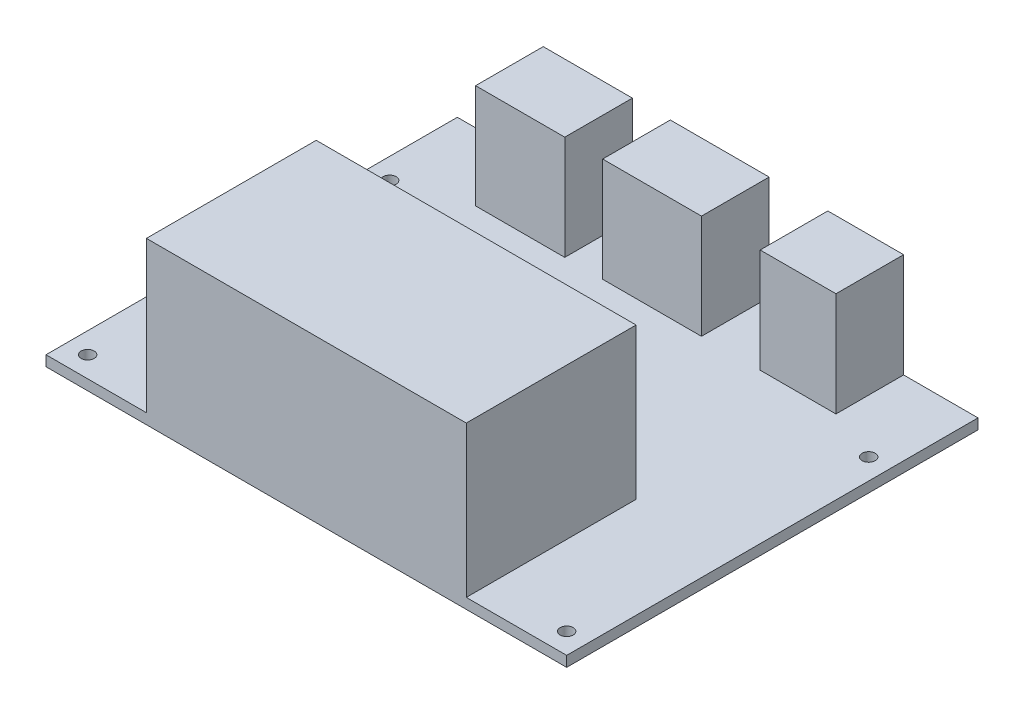
ISO-10303-21;
HEADER;
FILE_DESCRIPTION(('STEP AP214'),'2;1');
FILE_NAME('part.step','',(''),(''),'','','');
FILE_SCHEMA(('AUTOMOTIVE_DESIGN { 1 0 10303 214 1 1 1 1 }'));
ENDSEC;
DATA;
#1=APPLICATION_CONTEXT('core data for automotive mechanical design processes');
#2=APPLICATION_PROTOCOL_DEFINITION('international standard','automotive_design',2000,#1);
#3=PRODUCT_CONTEXT('',#1,'mechanical');
#4=PRODUCT('Part','Part','',(#3));
#5=PRODUCT_RELATED_PRODUCT_CATEGORY('part','',(#4));
#6=PRODUCT_DEFINITION_FORMATION('','',#4);
#7=PRODUCT_DEFINITION_CONTEXT('part definition',#1,'design');
#8=PRODUCT_DEFINITION('design','',#6,#7);
#9=PRODUCT_DEFINITION_SHAPE('','',#8);
#10=(LENGTH_UNIT() NAMED_UNIT(*) SI_UNIT(.MILLI.,.METRE.));
#11=(NAMED_UNIT(*) PLANE_ANGLE_UNIT() SI_UNIT($,.RADIAN.));
#12=(NAMED_UNIT(*) SI_UNIT($,.STERADIAN.) SOLID_ANGLE_UNIT());
#13=UNCERTAINTY_MEASURE_WITH_UNIT(LENGTH_MEASURE(1.E-05),#10,'distance_accuracy_value','');
#14=(GEOMETRIC_REPRESENTATION_CONTEXT(3) GLOBAL_UNCERTAINTY_ASSIGNED_CONTEXT((#13)) GLOBAL_UNIT_ASSIGNED_CONTEXT((#10,
#11,#12)) REPRESENTATION_CONTEXT('',''));
#15=CARTESIAN_POINT('',(0.,0.,0.));
#16=DIRECTION('',(0.,0.,1.));
#17=DIRECTION('',(1.,0.,0.));
#18=AXIS2_PLACEMENT_3D('',#15,#16,#17);
#19=CARTESIAN_POINT('',(0.,2.,0.));
#20=DIRECTION('',(0.,-1.,0.));
#21=DIRECTION('',(0.,0.,-1.));
#22=AXIS2_PLACEMENT_3D('',#19,#20,#21);
#23=PLANE('',#22);
#24=CARTESIAN_POINT('',(-46.,2.,-22.5));
#25=DIRECTION('',(0.,1.,0.));
#26=DIRECTION('',(0.,0.,1.));
#27=AXIS2_PLACEMENT_3D('',#24,#25,#26);
#28=CIRCLE('',#27,1.25);
#29=CARTESIAN_POINT('',(-46.,2.,-21.25));
#30=VERTEX_POINT('',#29);
#31=EDGE_CURVE('E437',#30,#30,#28,.T.);
#32=ORIENTED_EDGE('',*,*,#31,.F.);
#33=EDGE_LOOP('',(#32));
#34=FACE_BOUND('',#33,.T.);
#35=CARTESIAN_POINT('',(46.,2.,-22.5));
#36=DIRECTION('',(0.,1.,0.));
#37=DIRECTION('',(0.,0.,1.));
#38=AXIS2_PLACEMENT_3D('',#35,#36,#37);
#39=CIRCLE('',#38,1.25);
#40=CARTESIAN_POINT('',(46.,2.,-21.25));
#41=VERTEX_POINT('',#40);
#42=EDGE_CURVE('E429',#41,#41,#39,.T.);
#43=ORIENTED_EDGE('',*,*,#42,.F.);
#44=EDGE_LOOP('',(#43));
#45=FACE_BOUND('',#44,.T.);
#46=CARTESIAN_POINT('',(46.,2.,35.5));
#47=DIRECTION('',(0.,1.,0.));
#48=DIRECTION('',(0.,0.,1.));
#49=AXIS2_PLACEMENT_3D('',#46,#47,#48);
#50=CIRCLE('',#49,1.25);
#51=CARTESIAN_POINT('',(46.,2.,36.75));
#52=VERTEX_POINT('',#51);
#53=EDGE_CURVE('E421',#52,#52,#50,.T.);
#54=ORIENTED_EDGE('',*,*,#53,.F.);
#55=EDGE_LOOP('',(#54));
#56=FACE_BOUND('',#55,.T.);
#57=CARTESIAN_POINT('',(-46.,2.,35.5));
#58=DIRECTION('',(0.,1.,0.));
#59=DIRECTION('',(0.,0.,1.));
#60=AXIS2_PLACEMENT_3D('',#57,#58,#59);
#61=CIRCLE('',#60,1.25);
#62=CARTESIAN_POINT('',(-46.,2.,36.75));
#63=VERTEX_POINT('',#62);
#64=EDGE_CURVE('E413',#63,#63,#61,.T.);
#65=ORIENTED_EDGE('',*,*,#64,.F.);
#66=EDGE_LOOP('',(#65));
#67=FACE_BOUND('',#66,.T.);
#68=DIRECTION('',(0.,0.,1.));
#69=VECTOR('',#68,1.);
#70=CARTESIAN_POINT('',(21.1569560609766,2.,-39.5));
#71=LINE('',#70,#69);
#72=CARTESIAN_POINT('',(21.1569560609766,2.,-39.5));
#73=VERTEX_POINT('',#72);
#74=CARTESIAN_POINT('',(21.1569560609766,2.,-26.5086312871932));
#75=VERTEX_POINT('',#74);
#76=EDGE_CURVE('E219',#73,#75,#71,.T.);
#77=ORIENTED_EDGE('',*,*,#76,.F.);
#78=DIRECTION('',(-1.,0.,0.));
#79=VECTOR('',#78,1.);
#80=CARTESIAN_POINT('',(-50.,2.,-39.5));
#81=LINE('',#80,#79);
#82=CARTESIAN_POINT('',(9.88276025108013,2.,-39.5));
#83=VERTEX_POINT('',#82);
#84=EDGE_CURVE('E204',#73,#83,#81,.T.);
#85=ORIENTED_EDGE('',*,*,#84,.T.);
#86=DIRECTION('',(0.,0.,-1.));
#87=VECTOR('',#86,1.);
#88=CARTESIAN_POINT('',(9.88276025108013,2.,-39.5));
#89=LINE('',#88,#87);
#90=CARTESIAN_POINT('',(9.88276025108013,2.,-26.5086312871932));
#91=VERTEX_POINT('',#90);
#92=EDGE_CURVE('E266',#91,#83,#89,.T.);
#93=ORIENTED_EDGE('',*,*,#92,.F.);
#94=DIRECTION('',(1.,0.,0.));
#95=VECTOR('',#94,1.);
#96=CARTESIAN_POINT('',(-9.09784788456836,2.,-26.5086312871932));
#97=LINE('',#96,#95);
#98=CARTESIAN_POINT('',(-9.09784788456836,2.,-26.5086312871932));
#99=VERTEX_POINT('',#98);
#100=EDGE_CURVE('E269',#99,#91,#97,.T.);
#101=ORIENTED_EDGE('',*,*,#100,.F.);
#102=DIRECTION('',(0.,0.,1.));
#103=VECTOR('',#102,1.);
#104=CARTESIAN_POINT('',(-9.09784788456836,2.,-39.5));
#105=LINE('',#104,#103);
#106=CARTESIAN_POINT('',(-9.09784788456836,2.,-39.5));
#107=VERTEX_POINT('',#106);
#108=EDGE_CURVE('E274',#107,#99,#105,.T.);
#109=ORIENTED_EDGE('',*,*,#108,.F.);
#110=CARTESIAN_POINT('',(-16.376126192223,2.,-39.5));
#111=VERTEX_POINT('',#110);
#112=EDGE_CURVE('E216',#107,#111,#81,.T.);
#113=ORIENTED_EDGE('',*,*,#112,.T.);
#114=DIRECTION('',(0.,0.,-1.));
#115=VECTOR('',#114,1.);
#116=CARTESIAN_POINT('',(-16.376126192223,2.,-39.5));
#117=LINE('',#116,#115);
#118=CARTESIAN_POINT('',(-16.376126192223,2.,-26.5086312871932));
#119=VERTEX_POINT('',#118);
#120=EDGE_CURVE('E295',#119,#111,#117,.T.);
#121=ORIENTED_EDGE('',*,*,#120,.F.);
#122=DIRECTION('',(1.,0.,0.));
#123=VECTOR('',#122,1.);
#124=CARTESIAN_POINT('',(-33.5014869161164,2.,-26.5086312871932));
#125=LINE('',#124,#123);
#126=CARTESIAN_POINT('',(-33.5014869161164,2.,-26.5086312871932));
#127=VERTEX_POINT('',#126);
#128=EDGE_CURVE('E308',#127,#119,#125,.T.);
#129=ORIENTED_EDGE('',*,*,#128,.F.);
#130=DIRECTION('',(0.,0.,1.));
#131=VECTOR('',#130,1.);
#132=CARTESIAN_POINT('',(-33.5014869161164,2.,-39.5));
#133=LINE('',#132,#131);
#134=CARTESIAN_POINT('',(-33.5014869161164,2.,-39.5));
#135=VERTEX_POINT('',#134);
#136=EDGE_CURVE('E278',#135,#127,#133,.T.);
#137=ORIENTED_EDGE('',*,*,#136,.F.);
#138=CARTESIAN_POINT('',(-50.,2.,-39.5));
#139=VERTEX_POINT('',#138);
#140=EDGE_CURVE('E448',#135,#139,#81,.T.);
#141=ORIENTED_EDGE('',*,*,#140,.T.);
#142=DIRECTION('',(0.,0.,1.));
#143=VECTOR('',#142,1.);
#144=CARTESIAN_POINT('',(-50.,2.,39.5));
#145=LINE('',#144,#143);
#146=CARTESIAN_POINT('',(-50.,2.,39.5));
#147=VERTEX_POINT('',#146);
#148=EDGE_CURVE('E452',#139,#147,#145,.T.);
#149=ORIENTED_EDGE('',*,*,#148,.T.);
#150=DIRECTION('',(1.,0.,0.));
#151=VECTOR('',#150,1.);
#152=CARTESIAN_POINT('',(-50.,2.,39.5));
#153=LINE('',#152,#151);
#154=CARTESIAN_POINT('',(-30.7186157984837,2.,39.5));
#155=VERTEX_POINT('',#154);
#156=EDGE_CURVE('E456',#147,#155,#153,.T.);
#157=ORIENTED_EDGE('',*,*,#156,.T.);
#158=DIRECTION('',(0.,0.,1.));
#159=VECTOR('',#158,1.);
#160=CARTESIAN_POINT('',(-30.7186157984837,2.,39.5));
#161=LINE('',#160,#159);
#162=CARTESIAN_POINT('',(-30.7186157984837,2.,6.88582212439877));
#163=VERTEX_POINT('',#162);
#164=EDGE_CURVE('E330',#163,#155,#161,.T.);
#165=ORIENTED_EDGE('',*,*,#164,.F.);
#166=DIRECTION('',(-1.,0.,0.));
#167=VECTOR('',#166,1.);
#168=CARTESIAN_POINT('',(-30.7186157984837,2.,6.88582212439877));
#169=LINE('',#168,#167);
#170=CARTESIAN_POINT('',(30.7186157984837,2.,6.88582212439877));
#171=VERTEX_POINT('',#170);
#172=EDGE_CURVE('E336',#171,#163,#169,.T.);
#173=ORIENTED_EDGE('',*,*,#172,.F.);
#174=DIRECTION('',(0.,0.,-1.));
#175=VECTOR('',#174,1.);
#176=CARTESIAN_POINT('',(30.7186157984837,2.,39.5));
#177=LINE('',#176,#175);
#178=CARTESIAN_POINT('',(30.7186157984837,2.,39.5));
#179=VERTEX_POINT('',#178);
#180=EDGE_CURVE('E349',#179,#171,#177,.T.);
#181=ORIENTED_EDGE('',*,*,#180,.F.);
#182=CARTESIAN_POINT('',(50.,2.,39.5));
#183=VERTEX_POINT('',#182);
#184=EDGE_CURVE('E455',#179,#183,#153,.T.);
#185=ORIENTED_EDGE('',*,*,#184,.T.);
#186=DIRECTION('',(0.,0.,-1.));
#187=VECTOR('',#186,1.);
#188=CARTESIAN_POINT('',(50.,2.,39.5));
#189=LINE('',#188,#187);
#190=CARTESIAN_POINT('',(50.,2.,-39.5));
#191=VERTEX_POINT('',#190);
#192=EDGE_CURVE('E445',#183,#191,#189,.T.);
#193=ORIENTED_EDGE('',*,*,#192,.T.);
#194=CARTESIAN_POINT('',(35.713512676286,2.,-39.5));
#195=VERTEX_POINT('',#194);
#196=EDGE_CURVE('E215',#191,#195,#81,.T.);
#197=ORIENTED_EDGE('',*,*,#196,.T.);
#198=DIRECTION('',(0.,0.,-1.));
#199=VECTOR('',#198,1.);
#200=CARTESIAN_POINT('',(35.713512676286,2.,-39.5));
#201=LINE('',#200,#199);
#202=CARTESIAN_POINT('',(35.713512676286,2.,-26.5086312871932));
#203=VERTEX_POINT('',#202);
#204=EDGE_CURVE('E64',#203,#195,#201,.T.);
#205=ORIENTED_EDGE('',*,*,#204,.F.);
#206=DIRECTION('',(1.,0.,0.));
#207=VECTOR('',#206,1.);
#208=CARTESIAN_POINT('',(21.1569560609766,2.,-26.5086312871932));
#209=LINE('',#208,#207);
#210=EDGE_CURVE('E59',#75,#203,#209,.T.);
#211=ORIENTED_EDGE('',*,*,#210,.F.);
#212=EDGE_LOOP('',(#77,#85,#93,#101,#109,#113,#121,#129,#137,#141,#149,#157,#165,#173,#181,#185,
#193,#197,#205,#211));
#213=FACE_BOUND('',#212,.T.);
#214=ADVANCED_FACE('F43',(#34,#45,#56,#67,#213),#23,.F.);
#215=CARTESIAN_POINT('',(0.,0.,0.));
#216=DIRECTION('',(0.,-1.,0.));
#217=DIRECTION('',(0.,0.,-1.));
#218=AXIS2_PLACEMENT_3D('',#215,#216,#217);
#219=PLANE('',#218);
#220=CARTESIAN_POINT('',(46.,0.,35.5));
#221=DIRECTION('',(0.,1.,0.));
#222=DIRECTION('',(0.,0.,1.));
#223=AXIS2_PLACEMENT_3D('',#220,#221,#222);
#224=CIRCLE('',#223,1.25);
#225=CARTESIAN_POINT('',(46.,0.,36.75));
#226=VERTEX_POINT('',#225);
#227=EDGE_CURVE('E417',#226,#226,#224,.T.);
#228=ORIENTED_EDGE('',*,*,#227,.T.);
#229=EDGE_LOOP('',(#228));
#230=FACE_BOUND('',#229,.T.);
#231=CARTESIAN_POINT('',(-46.,0.,-22.5));
#232=DIRECTION('',(0.,1.,0.));
#233=DIRECTION('',(0.,0.,1.));
#234=AXIS2_PLACEMENT_3D('',#231,#232,#233);
#235=CIRCLE('',#234,1.25);
#236=CARTESIAN_POINT('',(-46.,0.,-21.25));
#237=VERTEX_POINT('',#236);
#238=EDGE_CURVE('E433',#237,#237,#235,.T.);
#239=ORIENTED_EDGE('',*,*,#238,.T.);
#240=EDGE_LOOP('',(#239));
#241=FACE_BOUND('',#240,.T.);
#242=DIRECTION('',(0.,0.,-1.));
#243=VECTOR('',#242,1.);
#244=CARTESIAN_POINT('',(50.,0.,39.5));
#245=LINE('',#244,#243);
#246=CARTESIAN_POINT('',(50.,0.,39.5));
#247=VERTEX_POINT('',#246);
#248=CARTESIAN_POINT('',(50.,0.,-39.5));
#249=VERTEX_POINT('',#248);
#250=EDGE_CURVE('E441',#247,#249,#245,.T.);
#251=ORIENTED_EDGE('',*,*,#250,.F.);
#252=DIRECTION('',(1.,0.,0.));
#253=VECTOR('',#252,1.);
#254=CARTESIAN_POINT('',(-50.,0.,39.5));
#255=LINE('',#254,#253);
#256=CARTESIAN_POINT('',(-50.,0.,39.5));
#257=VERTEX_POINT('',#256);
#258=EDGE_CURVE('E449',#257,#247,#255,.T.);
#259=ORIENTED_EDGE('',*,*,#258,.F.);
#260=DIRECTION('',(0.,0.,1.));
#261=VECTOR('',#260,1.);
#262=CARTESIAN_POINT('',(-50.,0.,39.5));
#263=LINE('',#262,#261);
#264=CARTESIAN_POINT('',(-50.,0.,-39.5));
#265=VERTEX_POINT('',#264);
#266=EDGE_CURVE('E466',#265,#257,#263,.T.);
#267=ORIENTED_EDGE('',*,*,#266,.F.);
#268=DIRECTION('',(-1.,0.,0.));
#269=VECTOR('',#268,1.);
#270=CARTESIAN_POINT('',(-50.,0.,-39.5));
#271=LINE('',#270,#269);
#272=EDGE_CURVE('E463',#249,#265,#271,.T.);
#273=ORIENTED_EDGE('',*,*,#272,.F.);
#274=EDGE_LOOP('',(#251,#259,#267,#273));
#275=FACE_BOUND('',#274,.T.);
#276=CARTESIAN_POINT('',(46.,0.,-22.5));
#277=DIRECTION('',(0.,1.,0.));
#278=DIRECTION('',(0.,0.,1.));
#279=AXIS2_PLACEMENT_3D('',#276,#277,#278);
#280=CIRCLE('',#279,1.25);
#281=CARTESIAN_POINT('',(46.,0.,-21.25));
#282=VERTEX_POINT('',#281);
#283=EDGE_CURVE('E425',#282,#282,#280,.T.);
#284=ORIENTED_EDGE('',*,*,#283,.T.);
#285=EDGE_LOOP('',(#284));
#286=FACE_BOUND('',#285,.T.);
#287=CARTESIAN_POINT('',(-46.,0.,35.5));
#288=DIRECTION('',(0.,1.,0.));
#289=DIRECTION('',(0.,0.,1.));
#290=AXIS2_PLACEMENT_3D('',#287,#288,#289);
#291=CIRCLE('',#290,1.25);
#292=CARTESIAN_POINT('',(-46.,0.,36.75));
#293=VERTEX_POINT('',#292);
#294=EDGE_CURVE('E412',#293,#293,#291,.T.);
#295=ORIENTED_EDGE('',*,*,#294,.T.);
#296=EDGE_LOOP('',(#295));
#297=FACE_BOUND('',#296,.T.);
#298=DIRECTION('',(1.,0.,0.));
#299=VECTOR('',#298,1.);
#300=CARTESIAN_POINT('',(-27.1122110581234,0.,8.12896276269668));
#301=LINE('',#300,#299);
#302=CARTESIAN_POINT('',(-27.1122110581234,0.,8.12896276269668));
#303=VERTEX_POINT('',#302);
#304=CARTESIAN_POINT('',(-4.48818242846663,0.,8.12896276269668));
#305=VERTEX_POINT('',#304);
#306=EDGE_CURVE('E390',#303,#305,#301,.T.);
#307=ORIENTED_EDGE('',*,*,#306,.F.);
#308=DIRECTION('',(0.,0.,-1.));
#309=VECTOR('',#308,1.);
#310=CARTESIAN_POINT('',(-27.1122110581234,0.,22.106111340181));
#311=LINE('',#310,#309);
#312=CARTESIAN_POINT('',(-27.1122110581234,0.,22.106111340181));
#313=VERTEX_POINT('',#312);
#314=EDGE_CURVE('E371',#313,#303,#311,.T.);
#315=ORIENTED_EDGE('',*,*,#314,.F.);
#316=DIRECTION('',(-1.,0.,0.));
#317=VECTOR('',#316,1.);
#318=CARTESIAN_POINT('',(-27.1122110581234,0.,22.106111340181));
#319=LINE('',#318,#317);
#320=CARTESIAN_POINT('',(-4.48818242846663,0.,22.106111340181));
#321=VERTEX_POINT('',#320);
#322=EDGE_CURVE('E377',#321,#313,#319,.T.);
#323=ORIENTED_EDGE('',*,*,#322,.F.);
#324=DIRECTION('',(0.,0.,1.));
#325=VECTOR('',#324,1.);
#326=CARTESIAN_POINT('',(-4.48818242846663,0.,22.106111340181));
#327=LINE('',#326,#325);
#328=EDGE_CURVE('E393',#305,#321,#327,.T.);
#329=ORIENTED_EDGE('',*,*,#328,.F.);
#330=EDGE_LOOP('',(#307,#315,#323,#329));
#331=FACE_BOUND('',#330,.T.);
#332=ADVANCED_FACE('F488',(#230,#241,#275,#286,#297,#331),#219,.T.);
#333=CARTESIAN_POINT('',(50.,2.,39.5));
#334=DIRECTION('',(-1.,0.,0.));
#335=DIRECTION('',(0.,0.,1.));
#336=AXIS2_PLACEMENT_3D('',#333,#334,#335);
#337=PLANE('',#336);
#338=ORIENTED_EDGE('',*,*,#250,.T.);
#339=DIRECTION('',(0.,-1.,0.));
#340=VECTOR('',#339,1.);
#341=CARTESIAN_POINT('',(50.,2.,-39.5));
#342=LINE('',#341,#340);
#343=EDGE_CURVE('E11',#191,#249,#342,.T.);
#344=ORIENTED_EDGE('',*,*,#343,.F.);
#345=ORIENTED_EDGE('',*,*,#192,.F.);
#346=DIRECTION('',(0.,-1.,0.));
#347=VECTOR('',#346,1.);
#348=CARTESIAN_POINT('',(50.,2.,39.5));
#349=LINE('',#348,#347);
#350=EDGE_CURVE('E459',#183,#247,#349,.T.);
#351=ORIENTED_EDGE('',*,*,#350,.T.);
#352=EDGE_LOOP('',(#338,#344,#345,#351));
#353=FACE_BOUND('',#352,.T.);
#354=ADVANCED_FACE('F45',(#353),#337,.F.);
#355=CARTESIAN_POINT('',(-50.,2.,-39.5));
#356=DIRECTION('',(0.,0.,1.));
#357=DIRECTION('',(1.,0.,0.));
#358=AXIS2_PLACEMENT_3D('',#355,#356,#357);
#359=PLANE('',#358);
#360=ORIENTED_EDGE('',*,*,#272,.T.);
#361=DIRECTION('',(0.,-1.,0.));
#362=VECTOR('',#361,1.);
#363=CARTESIAN_POINT('',(-50.,2.,-39.5));
#364=LINE('',#363,#362);
#365=EDGE_CURVE('E52',#139,#265,#364,.T.);
#366=ORIENTED_EDGE('',*,*,#365,.F.);
#367=ORIENTED_EDGE('',*,*,#140,.F.);
#368=DIRECTION('',(0.,-1.,0.));
#369=VECTOR('',#368,1.);
#370=CARTESIAN_POINT('',(-33.5014869161164,22.,-39.5));
#371=LINE('',#370,#369);
#372=CARTESIAN_POINT('',(-33.5014869161164,22.,-39.5));
#373=VERTEX_POINT('',#372);
#374=EDGE_CURVE('E304',#373,#135,#371,.T.);
#375=ORIENTED_EDGE('',*,*,#374,.F.);
#376=DIRECTION('',(-1.,0.,0.));
#377=VECTOR('',#376,1.);
#378=CARTESIAN_POINT('',(-33.5014869161164,22.,-39.5));
#379=LINE('',#378,#377);
#380=CARTESIAN_POINT('',(-16.376126192223,22.,-39.5));
#381=VERTEX_POINT('',#380);
#382=EDGE_CURVE('E301',#381,#373,#379,.T.);
#383=ORIENTED_EDGE('',*,*,#382,.F.);
#384=DIRECTION('',(0.,-1.,0.));
#385=VECTOR('',#384,1.);
#386=CARTESIAN_POINT('',(-16.376126192223,22.,-39.5));
#387=LINE('',#386,#385);
#388=EDGE_CURVE('E318',#381,#111,#387,.T.);
#389=ORIENTED_EDGE('',*,*,#388,.T.);
#390=ORIENTED_EDGE('',*,*,#112,.F.);
#391=DIRECTION('',(0.,-1.,0.));
#392=VECTOR('',#391,1.);
#393=CARTESIAN_POINT('',(-9.09784788456836,22.,-39.5));
#394=LINE('',#393,#392);
#395=CARTESIAN_POINT('',(-9.09784788456836,22.,-39.5));
#396=VERTEX_POINT('',#395);
#397=EDGE_CURVE('E261',#396,#107,#394,.T.);
#398=ORIENTED_EDGE('',*,*,#397,.F.);
#399=DIRECTION('',(-1.,0.,0.));
#400=VECTOR('',#399,1.);
#401=CARTESIAN_POINT('',(-9.09784788456836,22.,-39.5));
#402=LINE('',#401,#400);
#403=CARTESIAN_POINT('',(9.88276025108013,22.,-39.5));
#404=VERTEX_POINT('',#403);
#405=EDGE_CURVE('E265',#404,#396,#402,.T.);
#406=ORIENTED_EDGE('',*,*,#405,.F.);
#407=DIRECTION('',(0.,-1.,0.));
#408=VECTOR('',#407,1.);
#409=CARTESIAN_POINT('',(9.88276025108013,22.,-39.5));
#410=LINE('',#409,#408);
#411=EDGE_CURVE('E212',#404,#83,#410,.T.);
#412=ORIENTED_EDGE('',*,*,#411,.T.);
#413=ORIENTED_EDGE('',*,*,#84,.F.);
#414=DIRECTION('',(0.,-1.,0.));
#415=VECTOR('',#414,1.);
#416=CARTESIAN_POINT('',(21.1569560609766,22.,-39.5));
#417=LINE('',#416,#415);
#418=CARTESIAN_POINT('',(21.1569560609766,22.,-39.5));
#419=VERTEX_POINT('',#418);
#420=EDGE_CURVE('E208',#419,#73,#417,.T.);
#421=ORIENTED_EDGE('',*,*,#420,.F.);
#422=DIRECTION('',(-1.,0.,0.));
#423=VECTOR('',#422,1.);
#424=CARTESIAN_POINT('',(21.1569560609766,22.,-39.5));
#425=LINE('',#424,#423);
#426=CARTESIAN_POINT('',(35.713512676286,22.,-39.5));
#427=VERTEX_POINT('',#426);
#428=EDGE_CURVE('E229',#427,#419,#425,.T.);
#429=ORIENTED_EDGE('',*,*,#428,.F.);
#430=DIRECTION('',(0.,-1.,0.));
#431=VECTOR('',#430,1.);
#432=CARTESIAN_POINT('',(35.713512676286,22.,-39.5));
#433=LINE('',#432,#431);
#434=EDGE_CURVE('E230',#427,#195,#433,.T.);
#435=ORIENTED_EDGE('',*,*,#434,.T.);
#436=ORIENTED_EDGE('',*,*,#196,.F.);
#437=ORIENTED_EDGE('',*,*,#343,.T.);
#438=EDGE_LOOP('',(#360,#366,#367,#375,#383,#389,#390,#398,#406,#412,#413,#421,#429,#435,#436,#437));
#439=FACE_BOUND('',#438,.T.);
#440=ADVANCED_FACE('F205',(#439),#359,.F.);
#441=CARTESIAN_POINT('',(-50.,2.,39.5));
#442=DIRECTION('',(1.,0.,0.));
#443=DIRECTION('',(0.,0.,-1.));
#444=AXIS2_PLACEMENT_3D('',#441,#442,#443);
#445=PLANE('',#444);
#446=ORIENTED_EDGE('',*,*,#266,.T.);
#447=DIRECTION('',(0.,-1.,0.));
#448=VECTOR('',#447,1.);
#449=CARTESIAN_POINT('',(-50.,2.,39.5));
#450=LINE('',#449,#448);
#451=EDGE_CURVE('E474',#147,#257,#450,.T.);
#452=ORIENTED_EDGE('',*,*,#451,.F.);
#453=ORIENTED_EDGE('',*,*,#148,.F.);
#454=ORIENTED_EDGE('',*,*,#365,.T.);
#455=EDGE_LOOP('',(#446,#452,#453,#454));
#456=FACE_BOUND('',#455,.T.);
#457=ADVANCED_FACE('F483',(#456),#445,.F.);
#458=CARTESIAN_POINT('',(-50.,2.,39.5));
#459=DIRECTION('',(0.,0.,-1.));
#460=DIRECTION('',(-1.,0.,0.));
#461=AXIS2_PLACEMENT_3D('',#458,#459,#460);
#462=PLANE('',#461);
#463=ORIENTED_EDGE('',*,*,#258,.T.);
#464=ORIENTED_EDGE('',*,*,#350,.F.);
#465=ORIENTED_EDGE('',*,*,#184,.F.);
#466=DIRECTION('',(0.,-1.,0.));
#467=VECTOR('',#466,1.);
#468=CARTESIAN_POINT('',(30.7186157984837,31.,39.5));
#469=LINE('',#468,#467);
#470=CARTESIAN_POINT('',(30.7186157984837,31.,39.5));
#471=VERTEX_POINT('',#470);
#472=EDGE_CURVE('E363',#471,#179,#469,.T.);
#473=ORIENTED_EDGE('',*,*,#472,.F.);
#474=DIRECTION('',(1.,0.,0.));
#475=VECTOR('',#474,1.);
#476=CARTESIAN_POINT('',(-30.7186157984837,31.,39.5));
#477=LINE('',#476,#475);
#478=CARTESIAN_POINT('',(-30.7186157984837,31.,39.5));
#479=VERTEX_POINT('',#478);
#480=EDGE_CURVE('E335',#479,#471,#477,.T.);
#481=ORIENTED_EDGE('',*,*,#480,.F.);
#482=DIRECTION('',(0.,-1.,0.));
#483=VECTOR('',#482,1.);
#484=CARTESIAN_POINT('',(-30.7186157984837,31.,39.5));
#485=LINE('',#484,#483);
#486=EDGE_CURVE('E367',#479,#155,#485,.T.);
#487=ORIENTED_EDGE('',*,*,#486,.T.);
#488=ORIENTED_EDGE('',*,*,#156,.F.);
#489=ORIENTED_EDGE('',*,*,#451,.T.);
#490=EDGE_LOOP('',(#463,#464,#465,#473,#481,#487,#488,#489));
#491=FACE_BOUND('',#490,.T.);
#492=ADVANCED_FACE('F492',(#491),#462,.F.);
#493=CARTESIAN_POINT('',(-46.,2.,-22.5));
#494=DIRECTION('',(0.,-1.,0.));
#495=DIRECTION('',(0.,0.,-1.));
#496=AXIS2_PLACEMENT_3D('',#493,#494,#495);
#497=CYLINDRICAL_SURFACE('',#496,1.25);
#498=ORIENTED_EDGE('',*,*,#31,.T.);
#499=EDGE_LOOP('',(#498));
#500=FACE_BOUND('',#499,.T.);
#501=ORIENTED_EDGE('',*,*,#238,.F.);
#502=EDGE_LOOP('',(#501));
#503=FACE_BOUND('',#502,.T.);
#504=ADVANCED_FACE('F551',(#500,#503),#497,.F.);
#505=CARTESIAN_POINT('',(46.,2.,-22.5));
#506=DIRECTION('',(0.,-1.,0.));
#507=DIRECTION('',(0.,0.,-1.));
#508=AXIS2_PLACEMENT_3D('',#505,#506,#507);
#509=CYLINDRICAL_SURFACE('',#508,1.25);
#510=ORIENTED_EDGE('',*,*,#42,.T.);
#511=EDGE_LOOP('',(#510));
#512=FACE_BOUND('',#511,.T.);
#513=ORIENTED_EDGE('',*,*,#283,.F.);
#514=EDGE_LOOP('',(#513));
#515=FACE_BOUND('',#514,.T.);
#516=ADVANCED_FACE('F573',(#512,#515),#509,.F.);
#517=CARTESIAN_POINT('',(46.,2.,35.5));
#518=DIRECTION('',(0.,-1.,0.));
#519=DIRECTION('',(0.,0.,-1.));
#520=AXIS2_PLACEMENT_3D('',#517,#518,#519);
#521=CYLINDRICAL_SURFACE('',#520,1.25);
#522=ORIENTED_EDGE('',*,*,#53,.T.);
#523=EDGE_LOOP('',(#522));
#524=FACE_BOUND('',#523,.T.);
#525=ORIENTED_EDGE('',*,*,#227,.F.);
#526=EDGE_LOOP('',(#525));
#527=FACE_BOUND('',#526,.T.);
#528=ADVANCED_FACE('F580',(#524,#527),#521,.F.);
#529=CARTESIAN_POINT('',(-46.,2.,35.5));
#530=DIRECTION('',(0.,-1.,0.));
#531=DIRECTION('',(0.,0.,-1.));
#532=AXIS2_PLACEMENT_3D('',#529,#530,#531);
#533=CYLINDRICAL_SURFACE('',#532,1.25);
#534=ORIENTED_EDGE('',*,*,#64,.T.);
#535=EDGE_LOOP('',(#534));
#536=FACE_BOUND('',#535,.T.);
#537=ORIENTED_EDGE('',*,*,#294,.F.);
#538=EDGE_LOOP('',(#537));
#539=FACE_BOUND('',#538,.T.);
#540=ADVANCED_FACE('F587',(#536,#539),#533,.F.);
#541=CARTESIAN_POINT('',(-27.1122110581234,-3.,22.106111340181));
#542=DIRECTION('',(1.,0.,0.));
#543=DIRECTION('',(0.,0.,-1.));
#544=AXIS2_PLACEMENT_3D('',#541,#542,#543);
#545=PLANE('',#544);
#546=ORIENTED_EDGE('',*,*,#314,.T.);
#547=DIRECTION('',(0.,1.,0.));
#548=VECTOR('',#547,1.);
#549=CARTESIAN_POINT('',(-27.1122110581234,-3.,8.12896276269668));
#550=LINE('',#549,#548);
#551=CARTESIAN_POINT('',(-27.1122110581234,-3.,8.12896276269668));
#552=VERTEX_POINT('',#551);
#553=EDGE_CURVE('E409',#552,#303,#550,.T.);
#554=ORIENTED_EDGE('',*,*,#553,.F.);
#555=DIRECTION('',(0.,0.,-1.));
#556=VECTOR('',#555,1.);
#557=CARTESIAN_POINT('',(-27.1122110581234,-3.,22.106111340181));
#558=LINE('',#557,#556);
#559=CARTESIAN_POINT('',(-27.1122110581234,-3.,22.106111340181));
#560=VERTEX_POINT('',#559);
#561=EDGE_CURVE('E372',#560,#552,#558,.T.);
#562=ORIENTED_EDGE('',*,*,#561,.F.);
#563=DIRECTION('',(0.,1.,0.));
#564=VECTOR('',#563,1.);
#565=CARTESIAN_POINT('',(-27.1122110581234,-3.,22.106111340181));
#566=LINE('',#565,#564);
#567=EDGE_CURVE('E386',#560,#313,#566,.T.);
#568=ORIENTED_EDGE('',*,*,#567,.T.);
#569=EDGE_LOOP('',(#546,#554,#562,#568));
#570=FACE_BOUND('',#569,.T.);
#571=ADVANCED_FACE('F595',(#570),#545,.F.);
#572=CARTESIAN_POINT('',(-27.1122110581234,-3.,8.12896276269668));
#573=DIRECTION('',(0.,0.,1.));
#574=DIRECTION('',(1.,0.,0.));
#575=AXIS2_PLACEMENT_3D('',#572,#573,#574);
#576=PLANE('',#575);
#577=ORIENTED_EDGE('',*,*,#306,.T.);
#578=DIRECTION('',(0.,1.,0.));
#579=VECTOR('',#578,1.);
#580=CARTESIAN_POINT('',(-4.48818242846663,-3.,8.12896276269668));
#581=LINE('',#580,#579);
#582=CARTESIAN_POINT('',(-4.48818242846663,-3.,8.12896276269668));
#583=VERTEX_POINT('',#582);
#584=EDGE_CURVE('E405',#583,#305,#581,.T.);
#585=ORIENTED_EDGE('',*,*,#584,.F.);
#586=DIRECTION('',(1.,0.,0.));
#587=VECTOR('',#586,1.);
#588=CARTESIAN_POINT('',(-27.1122110581234,-3.,8.12896276269668));
#589=LINE('',#588,#587);
#590=EDGE_CURVE('E376',#552,#583,#589,.T.);
#591=ORIENTED_EDGE('',*,*,#590,.F.);
#592=ORIENTED_EDGE('',*,*,#553,.T.);
#593=EDGE_LOOP('',(#577,#585,#591,#592));
#594=FACE_BOUND('',#593,.T.);
#595=ADVANCED_FACE('F616',(#594),#576,.F.);
#596=CARTESIAN_POINT('',(-4.48818242846663,-3.,22.106111340181));
#597=DIRECTION('',(-1.,0.,0.));
#598=DIRECTION('',(0.,0.,1.));
#599=AXIS2_PLACEMENT_3D('',#596,#597,#598);
#600=PLANE('',#599);
#601=ORIENTED_EDGE('',*,*,#328,.T.);
#602=DIRECTION('',(0.,1.,0.));
#603=VECTOR('',#602,1.);
#604=CARTESIAN_POINT('',(-4.48818242846663,-3.,22.106111340181));
#605=LINE('',#604,#603);
#606=CARTESIAN_POINT('',(-4.48818242846663,-3.,22.106111340181));
#607=VERTEX_POINT('',#606);
#608=EDGE_CURVE('E402',#607,#321,#605,.T.);
#609=ORIENTED_EDGE('',*,*,#608,.F.);
#610=DIRECTION('',(0.,0.,1.));
#611=VECTOR('',#610,1.);
#612=CARTESIAN_POINT('',(-4.48818242846663,-3.,22.106111340181));
#613=LINE('',#612,#611);
#614=EDGE_CURVE('E380',#583,#607,#613,.T.);
#615=ORIENTED_EDGE('',*,*,#614,.F.);
#616=ORIENTED_EDGE('',*,*,#584,.T.);
#617=EDGE_LOOP('',(#601,#609,#615,#616));
#618=FACE_BOUND('',#617,.T.);
#619=ADVANCED_FACE('F623',(#618),#600,.F.);
#620=CARTESIAN_POINT('',(-27.1122110581234,-3.,22.106111340181));
#621=DIRECTION('',(0.,0.,-1.));
#622=DIRECTION('',(-1.,0.,0.));
#623=AXIS2_PLACEMENT_3D('',#620,#621,#622);
#624=PLANE('',#623);
#625=ORIENTED_EDGE('',*,*,#322,.T.);
#626=ORIENTED_EDGE('',*,*,#567,.F.);
#627=DIRECTION('',(-1.,0.,0.));
#628=VECTOR('',#627,1.);
#629=CARTESIAN_POINT('',(-27.1122110581234,-3.,22.106111340181));
#630=LINE('',#629,#628);
#631=EDGE_CURVE('E383',#607,#560,#630,.T.);
#632=ORIENTED_EDGE('',*,*,#631,.F.);
#633=ORIENTED_EDGE('',*,*,#608,.T.);
#634=EDGE_LOOP('',(#625,#626,#632,#633));
#635=FACE_BOUND('',#634,.T.);
#636=ADVANCED_FACE('F631',(#635),#624,.F.);
#637=CARTESIAN_POINT('',(0.,-3.,0.));
#638=DIRECTION('',(0.,-1.,0.));
#639=DIRECTION('',(0.,0.,-1.));
#640=AXIS2_PLACEMENT_3D('',#637,#638,#639);
#641=PLANE('',#640);
#642=ORIENTED_EDGE('',*,*,#561,.T.);
#643=ORIENTED_EDGE('',*,*,#590,.T.);
#644=ORIENTED_EDGE('',*,*,#614,.T.);
#645=ORIENTED_EDGE('',*,*,#631,.T.);
#646=EDGE_LOOP('',(#642,#643,#644,#645));
#647=FACE_BOUND('',#646,.T.);
#648=ADVANCED_FACE('F639',(#647),#641,.T.);
#649=CARTESIAN_POINT('',(-30.7186157984837,31.,39.5));
#650=DIRECTION('',(1.,0.,0.));
#651=DIRECTION('',(0.,0.,-1.));
#652=AXIS2_PLACEMENT_3D('',#649,#650,#651);
#653=PLANE('',#652);
#654=ORIENTED_EDGE('',*,*,#164,.T.);
#655=ORIENTED_EDGE('',*,*,#486,.F.);
#656=DIRECTION('',(0.,0.,1.));
#657=VECTOR('',#656,1.);
#658=CARTESIAN_POINT('',(-30.7186157984837,31.,39.5));
#659=LINE('',#658,#657);
#660=CARTESIAN_POINT('',(-30.7186157984837,31.,6.88582212439877));
#661=VERTEX_POINT('',#660);
#662=EDGE_CURVE('E331',#661,#479,#659,.T.);
#663=ORIENTED_EDGE('',*,*,#662,.F.);
#664=DIRECTION('',(0.,-1.,0.));
#665=VECTOR('',#664,1.);
#666=CARTESIAN_POINT('',(-30.7186157984837,31.,6.88582212439877));
#667=LINE('',#666,#665);
#668=EDGE_CURVE('E345',#661,#163,#667,.T.);
#669=ORIENTED_EDGE('',*,*,#668,.T.);
#670=EDGE_LOOP('',(#654,#655,#663,#669));
#671=FACE_BOUND('',#670,.T.);
#672=ADVANCED_FACE('F646',(#671),#653,.F.);
#673=CARTESIAN_POINT('',(30.7186157984837,31.,39.5));
#674=DIRECTION('',(-1.,0.,0.));
#675=DIRECTION('',(0.,0.,1.));
#676=AXIS2_PLACEMENT_3D('',#673,#674,#675);
#677=PLANE('',#676);
#678=ORIENTED_EDGE('',*,*,#180,.T.);
#679=DIRECTION('',(0.,-1.,0.));
#680=VECTOR('',#679,1.);
#681=CARTESIAN_POINT('',(30.7186157984837,31.,6.88582212439877));
#682=LINE('',#681,#680);
#683=CARTESIAN_POINT('',(30.7186157984837,31.,6.88582212439877));
#684=VERTEX_POINT('',#683);
#685=EDGE_CURVE('E359',#684,#171,#682,.T.);
#686=ORIENTED_EDGE('',*,*,#685,.F.);
#687=DIRECTION('',(0.,0.,-1.));
#688=VECTOR('',#687,1.);
#689=CARTESIAN_POINT('',(30.7186157984837,31.,39.5));
#690=LINE('',#689,#688);
#691=EDGE_CURVE('E339',#471,#684,#690,.T.);
#692=ORIENTED_EDGE('',*,*,#691,.F.);
#693=ORIENTED_EDGE('',*,*,#472,.T.);
#694=EDGE_LOOP('',(#678,#686,#692,#693));
#695=FACE_BOUND('',#694,.T.);
#696=ADVANCED_FACE('F653',(#695),#677,.F.);
#697=CARTESIAN_POINT('',(-30.7186157984837,31.,6.88582212439877));
#698=DIRECTION('',(0.,0.,1.));
#699=DIRECTION('',(1.,0.,0.));
#700=AXIS2_PLACEMENT_3D('',#697,#698,#699);
#701=PLANE('',#700);
#702=ORIENTED_EDGE('',*,*,#172,.T.);
#703=ORIENTED_EDGE('',*,*,#668,.F.);
#704=DIRECTION('',(-1.,0.,0.));
#705=VECTOR('',#704,1.);
#706=CARTESIAN_POINT('',(-30.7186157984837,31.,6.88582212439877));
#707=LINE('',#706,#705);
#708=EDGE_CURVE('E342',#684,#661,#707,.T.);
#709=ORIENTED_EDGE('',*,*,#708,.F.);
#710=ORIENTED_EDGE('',*,*,#685,.T.);
#711=EDGE_LOOP('',(#702,#703,#709,#710));
#712=FACE_BOUND('',#711,.T.);
#713=ADVANCED_FACE('F661',(#712),#701,.F.);
#714=CARTESIAN_POINT('',(0.,31.,0.));
#715=DIRECTION('',(0.,-1.,0.));
#716=DIRECTION('',(0.,0.,-1.));
#717=AXIS2_PLACEMENT_3D('',#714,#715,#716);
#718=PLANE('',#717);
#719=ORIENTED_EDGE('',*,*,#662,.T.);
#720=ORIENTED_EDGE('',*,*,#480,.T.);
#721=ORIENTED_EDGE('',*,*,#691,.T.);
#722=ORIENTED_EDGE('',*,*,#708,.T.);
#723=EDGE_LOOP('',(#719,#720,#721,#722));
#724=FACE_BOUND('',#723,.T.);
#725=ADVANCED_FACE('F669',(#724),#718,.F.);
#726=CARTESIAN_POINT('',(-33.5014869161164,22.,-39.5));
#727=DIRECTION('',(1.,0.,0.));
#728=DIRECTION('',(0.,0.,-1.));
#729=AXIS2_PLACEMENT_3D('',#726,#727,#728);
#730=PLANE('',#729);
#731=ORIENTED_EDGE('',*,*,#136,.T.);
#732=DIRECTION('',(0.,-1.,0.));
#733=VECTOR('',#732,1.);
#734=CARTESIAN_POINT('',(-33.5014869161164,22.,-26.5086312871932));
#735=LINE('',#734,#733);
#736=CARTESIAN_POINT('',(-33.5014869161164,22.,-26.5086312871932));
#737=VERTEX_POINT('',#736);
#738=EDGE_CURVE('E326',#737,#127,#735,.T.);
#739=ORIENTED_EDGE('',*,*,#738,.F.);
#740=DIRECTION('',(0.,0.,1.));
#741=VECTOR('',#740,1.);
#742=CARTESIAN_POINT('',(-33.5014869161164,22.,-39.5));
#743=LINE('',#742,#741);
#744=EDGE_CURVE('E290',#373,#737,#743,.T.);
#745=ORIENTED_EDGE('',*,*,#744,.F.);
#746=ORIENTED_EDGE('',*,*,#374,.T.);
#747=EDGE_LOOP('',(#731,#739,#745,#746));
#748=FACE_BOUND('',#747,.T.);
#749=ADVANCED_FACE('F508',(#748),#730,.F.);
#750=CARTESIAN_POINT('',(-33.5014869161164,22.,-26.5086312871932));
#751=DIRECTION('',(0.,0.,-1.));
#752=DIRECTION('',(-1.,0.,0.));
#753=AXIS2_PLACEMENT_3D('',#750,#751,#752);
#754=PLANE('',#753);
#755=ORIENTED_EDGE('',*,*,#128,.T.);
#756=DIRECTION('',(0.,-1.,0.));
#757=VECTOR('',#756,1.);
#758=CARTESIAN_POINT('',(-16.376126192223,22.,-26.5086312871932));
#759=LINE('',#758,#757);
#760=CARTESIAN_POINT('',(-16.376126192223,22.,-26.5086312871932));
#761=VERTEX_POINT('',#760);
#762=EDGE_CURVE('E322',#761,#119,#759,.T.);
#763=ORIENTED_EDGE('',*,*,#762,.F.);
#764=DIRECTION('',(1.,0.,0.));
#765=VECTOR('',#764,1.);
#766=CARTESIAN_POINT('',(-33.5014869161164,22.,-26.5086312871932));
#767=LINE('',#766,#765);
#768=EDGE_CURVE('E294',#737,#761,#767,.T.);
#769=ORIENTED_EDGE('',*,*,#768,.F.);
#770=ORIENTED_EDGE('',*,*,#738,.T.);
#771=EDGE_LOOP('',(#755,#763,#769,#770));
#772=FACE_BOUND('',#771,.T.);
#773=ADVANCED_FACE('F708',(#772),#754,.F.);
#774=CARTESIAN_POINT('',(-16.376126192223,22.,-39.5));
#775=DIRECTION('',(-1.,0.,0.));
#776=DIRECTION('',(0.,0.,1.));
#777=AXIS2_PLACEMENT_3D('',#774,#775,#776);
#778=PLANE('',#777);
#779=ORIENTED_EDGE('',*,*,#120,.T.);
#780=ORIENTED_EDGE('',*,*,#388,.F.);
#781=DIRECTION('',(0.,0.,-1.));
#782=VECTOR('',#781,1.);
#783=CARTESIAN_POINT('',(-16.376126192223,22.,-39.5));
#784=LINE('',#783,#782);
#785=EDGE_CURVE('E298',#761,#381,#784,.T.);
#786=ORIENTED_EDGE('',*,*,#785,.F.);
#787=ORIENTED_EDGE('',*,*,#762,.T.);
#788=EDGE_LOOP('',(#779,#780,#786,#787));
#789=FACE_BOUND('',#788,.T.);
#790=ADVANCED_FACE('F515',(#789),#778,.F.);
#791=CARTESIAN_POINT('',(0.,22.,0.));
#792=DIRECTION('',(0.,1.,0.));
#793=DIRECTION('',(0.,0.,1.));
#794=AXIS2_PLACEMENT_3D('',#791,#792,#793);
#795=PLANE('',#794);
#796=ORIENTED_EDGE('',*,*,#744,.T.);
#797=ORIENTED_EDGE('',*,*,#768,.T.);
#798=ORIENTED_EDGE('',*,*,#785,.T.);
#799=ORIENTED_EDGE('',*,*,#382,.T.);
#800=EDGE_LOOP('',(#796,#797,#798,#799));
#801=FACE_BOUND('',#800,.T.);
#802=ADVANCED_FACE('F510',(#801),#795,.T.);
#803=CARTESIAN_POINT('',(-9.09784788456836,22.,-39.5));
#804=DIRECTION('',(1.,0.,0.));
#805=DIRECTION('',(0.,0.,-1.));
#806=AXIS2_PLACEMENT_3D('',#803,#804,#805);
#807=PLANE('',#806);
#808=ORIENTED_EDGE('',*,*,#108,.T.);
#809=DIRECTION('',(0.,-1.,0.));
#810=VECTOR('',#809,1.);
#811=CARTESIAN_POINT('',(-9.09784788456836,22.,-26.5086312871932));
#812=LINE('',#811,#810);
#813=CARTESIAN_POINT('',(-9.09784788456836,22.,-26.5086312871932));
#814=VERTEX_POINT('',#813);
#815=EDGE_CURVE('E223',#814,#99,#812,.T.);
#816=ORIENTED_EDGE('',*,*,#815,.F.);
#817=DIRECTION('',(0.,0.,1.));
#818=VECTOR('',#817,1.);
#819=CARTESIAN_POINT('',(-9.09784788456836,22.,-39.5));
#820=LINE('',#819,#818);
#821=EDGE_CURVE('E270',#396,#814,#820,.T.);
#822=ORIENTED_EDGE('',*,*,#821,.F.);
#823=ORIENTED_EDGE('',*,*,#397,.T.);
#824=EDGE_LOOP('',(#808,#816,#822,#823));
#825=FACE_BOUND('',#824,.T.);
#826=ADVANCED_FACE('F521',(#825),#807,.F.);
#827=CARTESIAN_POINT('',(-9.09784788456836,22.,-26.5086312871932));
#828=DIRECTION('',(0.,0.,-1.));
#829=DIRECTION('',(-1.,0.,0.));
#830=AXIS2_PLACEMENT_3D('',#827,#828,#829);
#831=PLANE('',#830);
#832=ORIENTED_EDGE('',*,*,#100,.T.);
#833=DIRECTION('',(0.,-1.,0.));
#834=VECTOR('',#833,1.);
#835=CARTESIAN_POINT('',(9.88276025108013,22.,-26.5086312871932));
#836=LINE('',#835,#834);
#837=CARTESIAN_POINT('',(9.88276025108013,22.,-26.5086312871932));
#838=VERTEX_POINT('',#837);
#839=EDGE_CURVE('E255',#838,#91,#836,.T.);
#840=ORIENTED_EDGE('',*,*,#839,.F.);
#841=DIRECTION('',(1.,0.,0.));
#842=VECTOR('',#841,1.);
#843=CARTESIAN_POINT('',(-9.09784788456836,22.,-26.5086312871932));
#844=LINE('',#843,#842);
#845=EDGE_CURVE('E284',#814,#838,#844,.T.);
#846=ORIENTED_EDGE('',*,*,#845,.F.);
#847=ORIENTED_EDGE('',*,*,#815,.T.);
#848=EDGE_LOOP('',(#832,#840,#846,#847));
#849=FACE_BOUND('',#848,.T.);
#850=ADVANCED_FACE('F529',(#849),#831,.F.);
#851=CARTESIAN_POINT('',(9.88276025108013,22.,-39.5));
#852=DIRECTION('',(-1.,0.,0.));
#853=DIRECTION('',(0.,0.,1.));
#854=AXIS2_PLACEMENT_3D('',#851,#852,#853);
#855=PLANE('',#854);
#856=ORIENTED_EDGE('',*,*,#92,.T.);
#857=ORIENTED_EDGE('',*,*,#411,.F.);
#858=DIRECTION('',(0.,0.,-1.));
#859=VECTOR('',#858,1.);
#860=CARTESIAN_POINT('',(9.88276025108013,22.,-39.5));
#861=LINE('',#860,#859);
#862=EDGE_CURVE('E281',#838,#404,#861,.T.);
#863=ORIENTED_EDGE('',*,*,#862,.F.);
#864=ORIENTED_EDGE('',*,*,#839,.T.);
#865=EDGE_LOOP('',(#856,#857,#863,#864));
#866=FACE_BOUND('',#865,.T.);
#867=ADVANCED_FACE('F527',(#866),#855,.F.);
#868=CARTESIAN_POINT('',(0.,22.,0.));
#869=DIRECTION('',(0.,1.,0.));
#870=DIRECTION('',(0.,0.,1.));
#871=AXIS2_PLACEMENT_3D('',#868,#869,#870);
#872=PLANE('',#871);
#873=ORIENTED_EDGE('',*,*,#821,.T.);
#874=ORIENTED_EDGE('',*,*,#845,.T.);
#875=ORIENTED_EDGE('',*,*,#862,.T.);
#876=ORIENTED_EDGE('',*,*,#405,.T.);
#877=EDGE_LOOP('',(#873,#874,#875,#876));
#878=FACE_BOUND('',#877,.T.);
#879=ADVANCED_FACE('F523',(#878),#872,.T.);
#880=CARTESIAN_POINT('',(21.1569560609766,22.,-39.5));
#881=DIRECTION('',(1.,0.,0.));
#882=DIRECTION('',(0.,0.,-1.));
#883=AXIS2_PLACEMENT_3D('',#880,#881,#882);
#884=PLANE('',#883);
#885=ORIENTED_EDGE('',*,*,#76,.T.);
#886=DIRECTION('',(0.,-1.,0.));
#887=VECTOR('',#886,1.);
#888=CARTESIAN_POINT('',(21.1569560609766,22.,-26.5086312871932));
#889=LINE('',#888,#887);
#890=CARTESIAN_POINT('',(21.1569560609766,22.,-26.5086312871932));
#891=VERTEX_POINT('',#890);
#892=EDGE_CURVE('E817',#891,#75,#889,.T.);
#893=ORIENTED_EDGE('',*,*,#892,.F.);
#894=DIRECTION('',(0.,0.,1.));
#895=VECTOR('',#894,1.);
#896=CARTESIAN_POINT('',(21.1569560609766,22.,-39.5));
#897=LINE('',#896,#895);
#898=EDGE_CURVE('E227',#419,#891,#897,.T.);
#899=ORIENTED_EDGE('',*,*,#898,.F.);
#900=ORIENTED_EDGE('',*,*,#420,.T.);
#901=EDGE_LOOP('',(#885,#893,#899,#900));
#902=FACE_BOUND('',#901,.T.);
#903=ADVANCED_FACE('F225',(#902),#884,.F.);
#904=CARTESIAN_POINT('',(21.1569560609766,22.,-26.5086312871932));
#905=DIRECTION('',(0.,0.,-1.));
#906=DIRECTION('',(-1.,0.,0.));
#907=AXIS2_PLACEMENT_3D('',#904,#905,#906);
#908=PLANE('',#907);
#909=ORIENTED_EDGE('',*,*,#210,.T.);
#910=DIRECTION('',(0.,-1.,0.));
#911=VECTOR('',#910,1.);
#912=CARTESIAN_POINT('',(35.713512676286,22.,-26.5086312871932));
#913=LINE('',#912,#911);
#914=CARTESIAN_POINT('',(35.713512676286,22.,-26.5086312871932));
#915=VERTEX_POINT('',#914);
#916=EDGE_CURVE('E237',#915,#203,#913,.T.);
#917=ORIENTED_EDGE('',*,*,#916,.F.);
#918=DIRECTION('',(1.,0.,0.));
#919=VECTOR('',#918,1.);
#920=CARTESIAN_POINT('',(21.1569560609766,22.,-26.5086312871932));
#921=LINE('',#920,#919);
#922=EDGE_CURVE('E247',#891,#915,#921,.T.);
#923=ORIENTED_EDGE('',*,*,#922,.F.);
#924=ORIENTED_EDGE('',*,*,#892,.T.);
#925=EDGE_LOOP('',(#909,#917,#923,#924));
#926=FACE_BOUND('',#925,.T.);
#927=ADVANCED_FACE('F775',(#926),#908,.F.);
#928=CARTESIAN_POINT('',(35.713512676286,22.,-39.5));
#929=DIRECTION('',(-1.,0.,0.));
#930=DIRECTION('',(0.,0.,1.));
#931=AXIS2_PLACEMENT_3D('',#928,#929,#930);
#932=PLANE('',#931);
#933=ORIENTED_EDGE('',*,*,#204,.T.);
#934=ORIENTED_EDGE('',*,*,#434,.F.);
#935=DIRECTION('',(0.,0.,-1.));
#936=VECTOR('',#935,1.);
#937=CARTESIAN_POINT('',(35.713512676286,22.,-39.5));
#938=LINE('',#937,#936);
#939=EDGE_CURVE('E234',#915,#427,#938,.T.);
#940=ORIENTED_EDGE('',*,*,#939,.F.);
#941=ORIENTED_EDGE('',*,*,#916,.T.);
#942=EDGE_LOOP('',(#933,#934,#940,#941));
#943=FACE_BOUND('',#942,.T.);
#944=ADVANCED_FACE('F785',(#943),#932,.F.);
#945=CARTESIAN_POINT('',(0.,22.,0.));
#946=DIRECTION('',(0.,1.,0.));
#947=DIRECTION('',(0.,0.,1.));
#948=AXIS2_PLACEMENT_3D('',#945,#946,#947);
#949=PLANE('',#948);
#950=ORIENTED_EDGE('',*,*,#898,.T.);
#951=ORIENTED_EDGE('',*,*,#922,.T.);
#952=ORIENTED_EDGE('',*,*,#939,.T.);
#953=ORIENTED_EDGE('',*,*,#428,.T.);
#954=EDGE_LOOP('',(#950,#951,#952,#953));
#955=FACE_BOUND('',#954,.T.);
#956=ADVANCED_FACE('F796',(#955),#949,.T.);
#957=CLOSED_SHELL('',(#214,#332,#354,#440,#457,#492,#504,#516,#528,#540,#571,#595,#619,#636,
#648,#672,#696,#713,#725,#749,#773,#790,#802,#826,#850,#867,#879,#903,#927,#944,#956));
#958=MANIFOLD_SOLID_BREP('B2',#957);
#959=ADVANCED_BREP_SHAPE_REPRESENTATION('',(#18,#958),#14);
#960=SHAPE_DEFINITION_REPRESENTATION(#9,#959);
ENDSEC;
END-ISO-10303-21;
